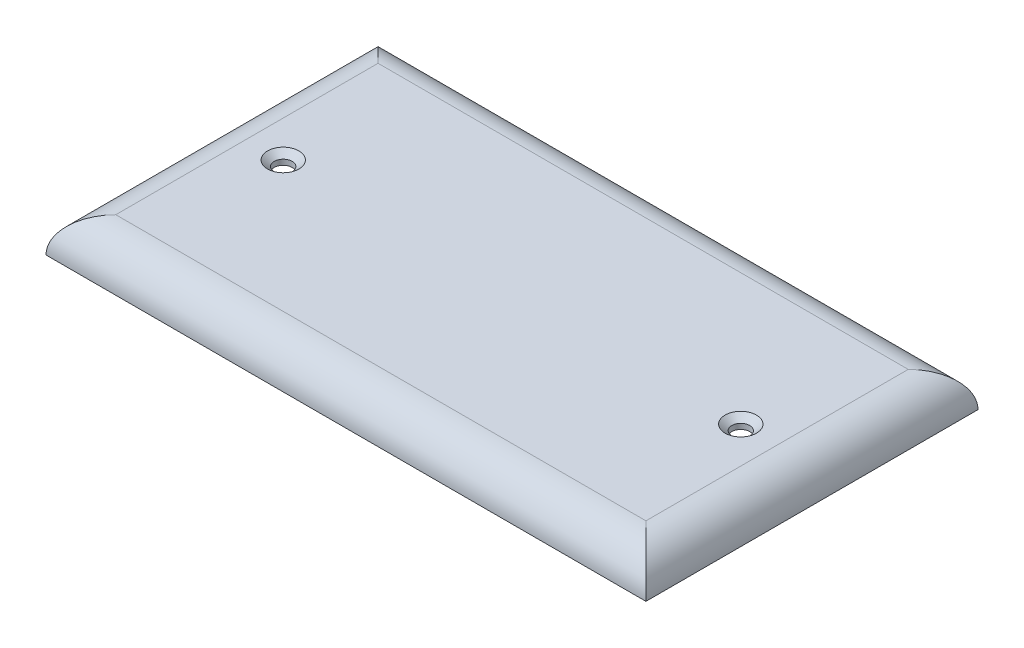
ISO-10303-21;
HEADER;
FILE_DESCRIPTION(('STEP AP214'),'2;1');
FILE_NAME('part.step','',(''),(''),'','','');
FILE_SCHEMA(('AUTOMOTIVE_DESIGN { 1 0 10303 214 1 1 1 1 }'));
ENDSEC;
DATA;
#1=APPLICATION_CONTEXT('core data for automotive mechanical design processes');
#2=APPLICATION_PROTOCOL_DEFINITION('international standard','automotive_design',2000,#1);
#3=PRODUCT_CONTEXT('',#1,'mechanical');
#4=PRODUCT('Part','Part','',(#3));
#5=PRODUCT_RELATED_PRODUCT_CATEGORY('part','',(#4));
#6=PRODUCT_DEFINITION_FORMATION('','',#4);
#7=PRODUCT_DEFINITION_CONTEXT('part definition',#1,'design');
#8=PRODUCT_DEFINITION('design','',#6,#7);
#9=PRODUCT_DEFINITION_SHAPE('','',#8);
#10=(LENGTH_UNIT() NAMED_UNIT(*) SI_UNIT(.MILLI.,.METRE.));
#11=(NAMED_UNIT(*) PLANE_ANGLE_UNIT() SI_UNIT($,.RADIAN.));
#12=(NAMED_UNIT(*) SI_UNIT($,.STERADIAN.) SOLID_ANGLE_UNIT());
#13=UNCERTAINTY_MEASURE_WITH_UNIT(LENGTH_MEASURE(1.E-05),#10,'distance_accuracy_value','');
#14=(GEOMETRIC_REPRESENTATION_CONTEXT(3) GLOBAL_UNCERTAINTY_ASSIGNED_CONTEXT((#13)) GLOBAL_UNIT_ASSIGNED_CONTEXT((#10,
#11,#12)) REPRESENTATION_CONTEXT('',''));
#15=CARTESIAN_POINT('',(0.,0.,0.));
#16=DIRECTION('',(0.,0.,1.));
#17=DIRECTION('',(1.,0.,0.));
#18=AXIS2_PLACEMENT_3D('',#15,#16,#17);
#19=CARTESIAN_POINT('',(0.,-3.175,0.));
#20=DIRECTION('',(0.,-1.,0.));
#21=DIRECTION('',(0.,0.,-1.));
#22=AXIS2_PLACEMENT_3D('',#19,#20,#21);
#23=PLANE('',#22);
#24=DIRECTION('',(0.,0.,-1.));
#25=VECTOR('',#24,1.);
#26=CARTESIAN_POINT('',(54.61,-3.175,30.226));
#27=LINE('',#26,#25);
#28=CARTESIAN_POINT('',(54.61,-3.175,30.226));
#29=VERTEX_POINT('',#28);
#30=CARTESIAN_POINT('',(54.61,-3.175,-30.226));
#31=VERTEX_POINT('',#30);
#32=EDGE_CURVE('E145',#29,#31,#27,.T.);
#33=ORIENTED_EDGE('',*,*,#32,.F.);
#34=DIRECTION('',(1.,0.,0.));
#35=VECTOR('',#34,1.);
#36=CARTESIAN_POINT('',(-54.61,-3.175,30.226));
#37=LINE('',#36,#35);
#38=CARTESIAN_POINT('',(-54.61,-3.175,30.226));
#39=VERTEX_POINT('',#38);
#40=EDGE_CURVE('E155',#39,#29,#37,.T.);
#41=ORIENTED_EDGE('',*,*,#40,.F.);
#42=DIRECTION('',(0.,0.,1.));
#43=VECTOR('',#42,1.);
#44=CARTESIAN_POINT('',(-54.61,-3.175,30.226));
#45=LINE('',#44,#43);
#46=CARTESIAN_POINT('',(-54.61,-3.175,-30.226));
#47=VERTEX_POINT('',#46);
#48=EDGE_CURVE('E152',#47,#39,#45,.T.);
#49=ORIENTED_EDGE('',*,*,#48,.F.);
#50=DIRECTION('',(-1.,0.,0.));
#51=VECTOR('',#50,1.);
#52=CARTESIAN_POINT('',(-54.61,-3.175,-30.226));
#53=LINE('',#52,#51);
#54=EDGE_CURVE('E148',#31,#47,#53,.T.);
#55=ORIENTED_EDGE('',*,*,#54,.F.);
#56=EDGE_LOOP('',(#33,#41,#49,#55));
#57=FACE_BOUND('',#56,.T.);
#58=DIRECTION('',(1.,0.,0.));
#59=VECTOR('',#58,1.);
#60=CARTESIAN_POINT('',(-52.61,-3.175,28.226));
#61=LINE('',#60,#59);
#62=CARTESIAN_POINT('',(-52.61,-3.175,28.226));
#63=VERTEX_POINT('',#62);
#64=CARTESIAN_POINT('',(52.61,-3.175,28.226));
#65=VERTEX_POINT('',#64);
#66=EDGE_CURVE('E130',#63,#65,#61,.T.);
#67=ORIENTED_EDGE('',*,*,#66,.T.);
#68=DIRECTION('',(0.,0.,-1.));
#69=VECTOR('',#68,1.);
#70=CARTESIAN_POINT('',(52.61,-3.175,28.226));
#71=LINE('',#70,#69);
#72=CARTESIAN_POINT('',(52.61,-3.175,-28.226));
#73=VERTEX_POINT('',#72);
#74=EDGE_CURVE('E134',#65,#73,#71,.T.);
#75=ORIENTED_EDGE('',*,*,#74,.T.);
#76=DIRECTION('',(-1.,0.,0.));
#77=VECTOR('',#76,1.);
#78=CARTESIAN_POINT('',(52.61,-3.175,-28.226));
#79=LINE('',#78,#77);
#80=CARTESIAN_POINT('',(-52.61,-3.175,-28.226));
#81=VERTEX_POINT('',#80);
#82=EDGE_CURVE('E140',#73,#81,#79,.T.);
#83=ORIENTED_EDGE('',*,*,#82,.T.);
#84=DIRECTION('',(0.,0.,1.));
#85=VECTOR('',#84,1.);
#86=CARTESIAN_POINT('',(-52.61,-3.175,-28.226));
#87=LINE('',#86,#85);
#88=EDGE_CURVE('E52',#81,#63,#87,.T.);
#89=ORIENTED_EDGE('',*,*,#88,.T.);
#90=EDGE_LOOP('',(#67,#75,#83,#89));
#91=FACE_BOUND('',#90,.T.);
#92=ADVANCED_FACE('F35',(#57,#91),#23,.T.);
#93=CARTESIAN_POINT('',(0.,3.175,0.));
#94=DIRECTION('',(0.,-1.,0.));
#95=DIRECTION('',(0.,0.,-1.));
#96=AXIS2_PLACEMENT_3D('',#93,#94,#95);
#97=PLANE('',#96);
#98=CARTESIAN_POINT('',(-41.65,3.175,0.));
#99=DIRECTION('',(0.,1.,0.));
#100=DIRECTION('',(0.,0.,1.));
#101=AXIS2_PLACEMENT_3D('',#98,#99,#100);
#102=CIRCLE('',#101,2.8575);
#103=CARTESIAN_POINT('',(-41.65,3.175,2.8575));
#104=VERTEX_POINT('',#103);
#105=EDGE_CURVE('E182',#104,#104,#102,.T.);
#106=ORIENTED_EDGE('',*,*,#105,.F.);
#107=EDGE_LOOP('',(#106));
#108=FACE_BOUND('',#107,.T.);
#109=CARTESIAN_POINT('',(41.65,3.175,0.));
#110=DIRECTION('',(0.,1.,0.));
#111=DIRECTION('',(0.,0.,1.));
#112=AXIS2_PLACEMENT_3D('',#109,#110,#111);
#113=CIRCLE('',#112,2.8575);
#114=CARTESIAN_POINT('',(41.65,3.175,2.8575));
#115=VERTEX_POINT('',#114);
#116=EDGE_CURVE('E173',#115,#115,#113,.T.);
#117=ORIENTED_EDGE('',*,*,#116,.F.);
#118=EDGE_LOOP('',(#117));
#119=FACE_BOUND('',#118,.T.);
#120=DIRECTION('',(-1.,0.,0.));
#121=VECTOR('',#120,1.);
#122=CARTESIAN_POINT('',(0.,3.175,-23.876));
#123=LINE('',#122,#121);
#124=CARTESIAN_POINT('',(48.26,3.175,-23.876));
#125=VERTEX_POINT('',#124);
#126=CARTESIAN_POINT('',(-48.26,3.175,-23.876));
#127=VERTEX_POINT('',#126);
#128=EDGE_CURVE('E44',#125,#127,#123,.T.);
#129=ORIENTED_EDGE('',*,*,#128,.T.);
#130=DIRECTION('',(0.,0.,1.));
#131=VECTOR('',#130,1.);
#132=CARTESIAN_POINT('',(-48.26,3.175,0.));
#133=LINE('',#132,#131);
#134=CARTESIAN_POINT('',(-48.26,3.175,23.876));
#135=VERTEX_POINT('',#134);
#136=EDGE_CURVE('E11',#127,#135,#133,.T.);
#137=ORIENTED_EDGE('',*,*,#136,.T.);
#138=DIRECTION('',(1.,0.,0.));
#139=VECTOR('',#138,1.);
#140=CARTESIAN_POINT('',(0.,3.175,23.876));
#141=LINE('',#140,#139);
#142=CARTESIAN_POINT('',(48.26,3.175,23.876));
#143=VERTEX_POINT('',#142);
#144=EDGE_CURVE('E158',#135,#143,#141,.T.);
#145=ORIENTED_EDGE('',*,*,#144,.T.);
#146=DIRECTION('',(0.,0.,-1.));
#147=VECTOR('',#146,1.);
#148=CARTESIAN_POINT('',(48.26,3.175,0.));
#149=LINE('',#148,#147);
#150=EDGE_CURVE('E160',#143,#125,#149,.T.);
#151=ORIENTED_EDGE('',*,*,#150,.T.);
#152=EDGE_LOOP('',(#129,#137,#145,#151));
#153=FACE_BOUND('',#152,.T.);
#154=ADVANCED_FACE('F188',(#108,#119,#153),#97,.F.);
#155=CARTESIAN_POINT('',(48.26,-3.175,0.));
#156=DIRECTION('',(0.,0.,-1.));
#157=DIRECTION('',(-1.,0.,0.));
#158=AXIS2_PLACEMENT_3D('',#155,#156,#157);
#159=CYLINDRICAL_SURFACE('',#158,6.35);
#160=CARTESIAN_POINT('',(48.26,-3.175,23.876));
#161=DIRECTION('',(0.707106781186547,0.,-0.707106781186547));
#162=DIRECTION('',(0.707106781186547,0.,0.707106781186547));
#163=AXIS2_PLACEMENT_3D('',#160,#161,#162);
#164=ELLIPSE('',#163,8.98025612106915,6.35);
#165=EDGE_CURVE('E164',#29,#143,#164,.F.);
#166=ORIENTED_EDGE('',*,*,#165,.F.);
#167=ORIENTED_EDGE('',*,*,#32,.T.);
#168=CARTESIAN_POINT('',(48.26,-3.175,-23.876));
#169=DIRECTION('',(-0.707106781186547,0.,-0.707106781186547));
#170=DIRECTION('',(0.707106781186547,0.,-0.707106781186547));
#171=AXIS2_PLACEMENT_3D('',#168,#169,#170);
#172=ELLIPSE('',#171,8.98025612106915,6.35);
#173=EDGE_CURVE('E149',#125,#31,#172,.T.);
#174=ORIENTED_EDGE('',*,*,#173,.F.);
#175=ORIENTED_EDGE('',*,*,#150,.F.);
#176=EDGE_LOOP('',(#166,#167,#174,#175));
#177=FACE_BOUND('',#176,.T.);
#178=ADVANCED_FACE('F37',(#177),#159,.T.);
#179=CARTESIAN_POINT('',(0.,-3.175,-23.876));
#180=DIRECTION('',(-1.,0.,0.));
#181=DIRECTION('',(0.,0.,1.));
#182=AXIS2_PLACEMENT_3D('',#179,#180,#181);
#183=CYLINDRICAL_SURFACE('',#182,6.35);
#184=ORIENTED_EDGE('',*,*,#173,.T.);
#185=ORIENTED_EDGE('',*,*,#54,.T.);
#186=CARTESIAN_POINT('',(-48.26,-3.175,-23.876));
#187=DIRECTION('',(-0.707106781186547,0.,0.707106781186547));
#188=DIRECTION('',(-0.707106781186547,0.,-0.707106781186547));
#189=AXIS2_PLACEMENT_3D('',#186,#187,#188);
#190=ELLIPSE('',#189,8.98025612106915,6.35);
#191=EDGE_CURVE('E125',#127,#47,#190,.T.);
#192=ORIENTED_EDGE('',*,*,#191,.F.);
#193=ORIENTED_EDGE('',*,*,#128,.F.);
#194=EDGE_LOOP('',(#184,#185,#192,#193));
#195=FACE_BOUND('',#194,.T.);
#196=ADVANCED_FACE('F221',(#195),#183,.T.);
#197=CARTESIAN_POINT('',(0.,-3.175,23.876));
#198=DIRECTION('',(1.,0.,0.));
#199=DIRECTION('',(0.,0.,-1.));
#200=AXIS2_PLACEMENT_3D('',#197,#198,#199);
#201=CYLINDRICAL_SURFACE('',#200,6.35);
#202=ORIENTED_EDGE('',*,*,#165,.T.);
#203=ORIENTED_EDGE('',*,*,#144,.F.);
#204=CARTESIAN_POINT('',(-48.26,-3.175,23.876));
#205=DIRECTION('',(0.707106781186547,0.,0.707106781186547));
#206=DIRECTION('',(0.707106781186547,0.,-0.707106781186547));
#207=AXIS2_PLACEMENT_3D('',#204,#205,#206);
#208=ELLIPSE('',#207,8.98025612106915,6.35);
#209=EDGE_CURVE('E123',#39,#135,#208,.F.);
#210=ORIENTED_EDGE('',*,*,#209,.F.);
#211=ORIENTED_EDGE('',*,*,#40,.T.);
#212=EDGE_LOOP('',(#202,#203,#210,#211));
#213=FACE_BOUND('',#212,.T.);
#214=ADVANCED_FACE('F218',(#213),#201,.T.);
#215=CARTESIAN_POINT('',(-48.26,-3.175,0.));
#216=DIRECTION('',(0.,0.,1.));
#217=DIRECTION('',(1.,0.,0.));
#218=AXIS2_PLACEMENT_3D('',#215,#216,#217);
#219=CYLINDRICAL_SURFACE('',#218,6.35);
#220=ORIENTED_EDGE('',*,*,#191,.T.);
#221=ORIENTED_EDGE('',*,*,#48,.T.);
#222=ORIENTED_EDGE('',*,*,#209,.T.);
#223=ORIENTED_EDGE('',*,*,#136,.F.);
#224=EDGE_LOOP('',(#220,#221,#222,#223));
#225=FACE_BOUND('',#224,.T.);
#226=ADVANCED_FACE('F215',(#225),#219,.T.);
#227=CARTESIAN_POINT('',(0.,1.175,0.));
#228=DIRECTION('',(0.,-1.,0.));
#229=DIRECTION('',(0.,0.,-1.));
#230=AXIS2_PLACEMENT_3D('',#227,#228,#229);
#231=PLANE('',#230);
#232=CARTESIAN_POINT('',(-41.65,1.175,0.));
#233=DIRECTION('',(0.,-1.,0.));
#234=DIRECTION('',(0.,0.,-1.));
#235=AXIS2_PLACEMENT_3D('',#232,#233,#234);
#236=CIRCLE('',#235,1.63195);
#237=CARTESIAN_POINT('',(-41.65,1.175,-1.63195));
#238=VERTEX_POINT('',#237);
#239=EDGE_CURVE('E39',#238,#238,#236,.T.);
#240=ORIENTED_EDGE('',*,*,#239,.F.);
#241=EDGE_LOOP('',(#240));
#242=FACE_BOUND('',#241,.T.);
#243=CARTESIAN_POINT('',(41.65,1.175,0.));
#244=DIRECTION('',(0.,-1.,0.));
#245=DIRECTION('',(0.,0.,-1.));
#246=AXIS2_PLACEMENT_3D('',#243,#244,#245);
#247=CIRCLE('',#246,1.63195);
#248=CARTESIAN_POINT('',(41.65,1.175,-1.63195));
#249=VERTEX_POINT('',#248);
#250=EDGE_CURVE('E137',#249,#249,#247,.T.);
#251=ORIENTED_EDGE('',*,*,#250,.F.);
#252=EDGE_LOOP('',(#251));
#253=FACE_BOUND('',#252,.T.);
#254=DIRECTION('',(1.,0.,0.));
#255=VECTOR('',#254,1.);
#256=CARTESIAN_POINT('',(0.,1.175,-23.876));
#257=LINE('',#256,#255);
#258=CARTESIAN_POINT('',(48.26,1.175,-23.876));
#259=VERTEX_POINT('',#258);
#260=CARTESIAN_POINT('',(-48.26,1.175,-23.876));
#261=VERTEX_POINT('',#260);
#262=EDGE_CURVE('E103',#259,#261,#257,.F.);
#263=ORIENTED_EDGE('',*,*,#262,.F.);
#264=DIRECTION('',(0.,0.,-1.));
#265=VECTOR('',#264,1.);
#266=CARTESIAN_POINT('',(48.26,1.175,0.));
#267=LINE('',#266,#265);
#268=CARTESIAN_POINT('',(48.26,1.175,23.876));
#269=VERTEX_POINT('',#268);
#270=EDGE_CURVE('E113',#269,#259,#267,.T.);
#271=ORIENTED_EDGE('',*,*,#270,.F.);
#272=DIRECTION('',(1.,0.,0.));
#273=VECTOR('',#272,1.);
#274=CARTESIAN_POINT('',(0.,1.175,23.876));
#275=LINE('',#274,#273);
#276=CARTESIAN_POINT('',(-48.26,1.175,23.876));
#277=VERTEX_POINT('',#276);
#278=EDGE_CURVE('E122',#277,#269,#275,.T.);
#279=ORIENTED_EDGE('',*,*,#278,.F.);
#280=DIRECTION('',(0.,0.,-1.));
#281=VECTOR('',#280,1.);
#282=CARTESIAN_POINT('',(-48.26,1.175,0.));
#283=LINE('',#282,#281);
#284=EDGE_CURVE('E112',#261,#277,#283,.F.);
#285=ORIENTED_EDGE('',*,*,#284,.F.);
#286=EDGE_LOOP('',(#263,#271,#279,#285));
#287=FACE_BOUND('',#286,.T.);
#288=ADVANCED_FACE('F121',(#242,#253,#287),#231,.T.);
#289=CARTESIAN_POINT('',(48.26,-3.175,0.));
#290=DIRECTION('',(0.,0.,-1.));
#291=DIRECTION('',(-1.,0.,0.));
#292=AXIS2_PLACEMENT_3D('',#289,#290,#291);
#293=CYLINDRICAL_SURFACE('',#292,4.35);
#294=CARTESIAN_POINT('',(48.26,-3.175,23.876));
#295=DIRECTION('',(0.707106781186547,0.,-0.707106781186547));
#296=DIRECTION('',(0.707106781186547,0.,0.707106781186547));
#297=AXIS2_PLACEMENT_3D('',#294,#295,#296);
#298=ELLIPSE('',#297,6.15182899632296,4.35);
#299=EDGE_CURVE('E117',#65,#269,#298,.F.);
#300=ORIENTED_EDGE('',*,*,#299,.T.);
#301=ORIENTED_EDGE('',*,*,#270,.T.);
#302=CARTESIAN_POINT('',(48.26,-3.175,-23.876));
#303=DIRECTION('',(-0.707106781186547,0.,-0.707106781186547));
#304=DIRECTION('',(-0.707106781186547,0.,0.707106781186547));
#305=AXIS2_PLACEMENT_3D('',#302,#303,#304);
#306=ELLIPSE('',#305,6.15182899632296,4.35);
#307=EDGE_CURVE('E108',#259,#73,#306,.T.);
#308=ORIENTED_EDGE('',*,*,#307,.T.);
#309=ORIENTED_EDGE('',*,*,#74,.F.);
#310=EDGE_LOOP('',(#300,#301,#308,#309));
#311=FACE_BOUND('',#310,.T.);
#312=ADVANCED_FACE('F254',(#311),#293,.F.);
#313=CARTESIAN_POINT('',(0.,-3.175,-23.876));
#314=DIRECTION('',(-1.,0.,0.));
#315=DIRECTION('',(0.,0.,1.));
#316=AXIS2_PLACEMENT_3D('',#313,#314,#315);
#317=CYLINDRICAL_SURFACE('',#316,4.35);
#318=ORIENTED_EDGE('',*,*,#307,.F.);
#319=ORIENTED_EDGE('',*,*,#262,.T.);
#320=CARTESIAN_POINT('',(-48.26,-3.175,-23.876));
#321=DIRECTION('',(-0.707106781186547,0.,0.707106781186547));
#322=DIRECTION('',(0.707106781186547,0.,0.707106781186547));
#323=AXIS2_PLACEMENT_3D('',#320,#321,#322);
#324=ELLIPSE('',#323,6.15182899632296,4.35);
#325=EDGE_CURVE('E105',#261,#81,#324,.T.);
#326=ORIENTED_EDGE('',*,*,#325,.T.);
#327=ORIENTED_EDGE('',*,*,#82,.F.);
#328=EDGE_LOOP('',(#318,#319,#326,#327));
#329=FACE_BOUND('',#328,.T.);
#330=ADVANCED_FACE('F104',(#329),#317,.F.);
#331=CARTESIAN_POINT('',(0.,-3.175,23.876));
#332=DIRECTION('',(1.,0.,0.));
#333=DIRECTION('',(0.,0.,-1.));
#334=AXIS2_PLACEMENT_3D('',#331,#332,#333);
#335=CYLINDRICAL_SURFACE('',#334,4.35);
#336=ORIENTED_EDGE('',*,*,#299,.F.);
#337=ORIENTED_EDGE('',*,*,#66,.F.);
#338=CARTESIAN_POINT('',(-48.26,-3.175,23.876));
#339=DIRECTION('',(0.707106781186547,0.,0.707106781186547));
#340=DIRECTION('',(-0.707106781186547,0.,0.707106781186547));
#341=AXIS2_PLACEMENT_3D('',#338,#339,#340);
#342=ELLIPSE('',#341,6.15182899632296,4.35);
#343=EDGE_CURVE('E118',#63,#277,#342,.F.);
#344=ORIENTED_EDGE('',*,*,#343,.T.);
#345=ORIENTED_EDGE('',*,*,#278,.T.);
#346=EDGE_LOOP('',(#336,#337,#344,#345));
#347=FACE_BOUND('',#346,.T.);
#348=ADVANCED_FACE('F291',(#347),#335,.F.);
#349=CARTESIAN_POINT('',(-48.26,-3.175,0.));
#350=DIRECTION('',(0.,0.,1.));
#351=DIRECTION('',(1.,0.,0.));
#352=AXIS2_PLACEMENT_3D('',#349,#350,#351);
#353=CYLINDRICAL_SURFACE('',#352,4.35);
#354=ORIENTED_EDGE('',*,*,#325,.F.);
#355=ORIENTED_EDGE('',*,*,#284,.T.);
#356=ORIENTED_EDGE('',*,*,#343,.F.);
#357=ORIENTED_EDGE('',*,*,#88,.F.);
#358=EDGE_LOOP('',(#354,#355,#356,#357));
#359=FACE_BOUND('',#358,.T.);
#360=ADVANCED_FACE('F116',(#359),#353,.F.);
#361=CARTESIAN_POINT('',(41.65,3.175,0.));
#362=DIRECTION('',(0.,1.,0.));
#363=DIRECTION('',(0.,0.,1.));
#364=AXIS2_PLACEMENT_3D('',#361,#362,#363);
#365=CYLINDRICAL_SURFACE('',#364,1.63195);
#366=ORIENTED_EDGE('',*,*,#250,.T.);
#367=EDGE_LOOP('',(#366));
#368=FACE_BOUND('',#367,.T.);
#369=CARTESIAN_POINT('',(41.65,2.14664144701068,0.));
#370=DIRECTION('',(0.,1.,0.));
#371=DIRECTION('',(0.,0.,1.));
#372=AXIS2_PLACEMENT_3D('',#369,#370,#371);
#373=CIRCLE('',#372,1.63195);
#374=CARTESIAN_POINT('',(41.65,2.14664144701068,1.63195));
#375=VERTEX_POINT('',#374);
#376=EDGE_CURVE('E169',#375,#375,#373,.T.);
#377=ORIENTED_EDGE('',*,*,#376,.T.);
#378=EDGE_LOOP('',(#377));
#379=FACE_BOUND('',#378,.T.);
#380=ADVANCED_FACE('F197',(#368,#379),#365,.F.);
#381=CARTESIAN_POINT('',(41.65,3.175,0.));
#382=DIRECTION('',(0.,1.,0.));
#383=DIRECTION('',(0.,0.,1.));
#384=AXIS2_PLACEMENT_3D('',#381,#382,#383);
#385=CONICAL_SURFACE('',#384,2.8575,0.872664625997163);
#386=ORIENTED_EDGE('',*,*,#376,.F.);
#387=EDGE_LOOP('',(#386));
#388=FACE_BOUND('',#387,.T.);
#389=ORIENTED_EDGE('',*,*,#116,.T.);
#390=EDGE_LOOP('',(#389));
#391=FACE_BOUND('',#390,.T.);
#392=ADVANCED_FACE('F194',(#388,#391),#385,.F.);
#393=CARTESIAN_POINT('',(-41.65,3.175,0.));
#394=DIRECTION('',(0.,1.,0.));
#395=DIRECTION('',(0.,0.,1.));
#396=AXIS2_PLACEMENT_3D('',#393,#394,#395);
#397=CYLINDRICAL_SURFACE('',#396,1.63195);
#398=ORIENTED_EDGE('',*,*,#239,.T.);
#399=EDGE_LOOP('',(#398));
#400=FACE_BOUND('',#399,.T.);
#401=CARTESIAN_POINT('',(-41.65,2.14664144701068,0.));
#402=DIRECTION('',(0.,1.,0.));
#403=DIRECTION('',(0.,0.,1.));
#404=AXIS2_PLACEMENT_3D('',#401,#402,#403);
#405=CIRCLE('',#404,1.63195);
#406=CARTESIAN_POINT('',(-41.65,2.14664144701068,1.63195));
#407=VERTEX_POINT('',#406);
#408=EDGE_CURVE('E179',#407,#407,#405,.T.);
#409=ORIENTED_EDGE('',*,*,#408,.T.);
#410=EDGE_LOOP('',(#409));
#411=FACE_BOUND('',#410,.T.);
#412=ADVANCED_FACE('F196',(#400,#411),#397,.F.);
#413=CARTESIAN_POINT('',(-41.65,3.175,0.));
#414=DIRECTION('',(0.,1.,0.));
#415=DIRECTION('',(0.,0.,1.));
#416=AXIS2_PLACEMENT_3D('',#413,#414,#415);
#417=CONICAL_SURFACE('',#416,2.8575,0.872664625997163);
#418=ORIENTED_EDGE('',*,*,#408,.F.);
#419=EDGE_LOOP('',(#418));
#420=FACE_BOUND('',#419,.T.);
#421=ORIENTED_EDGE('',*,*,#105,.T.);
#422=EDGE_LOOP('',(#421));
#423=FACE_BOUND('',#422,.T.);
#424=ADVANCED_FACE('F186',(#420,#423),#417,.F.);
#425=CLOSED_SHELL('',(#92,#154,#178,#196,#214,#226,#288,#312,#330,#348,#360,#380,#392,#412,#424));
#426=MANIFOLD_SOLID_BREP('B2',#425);
#427=ADVANCED_BREP_SHAPE_REPRESENTATION('',(#18,#426),#14);
#428=SHAPE_DEFINITION_REPRESENTATION(#9,#427);
ENDSEC;
END-ISO-10303-21;
